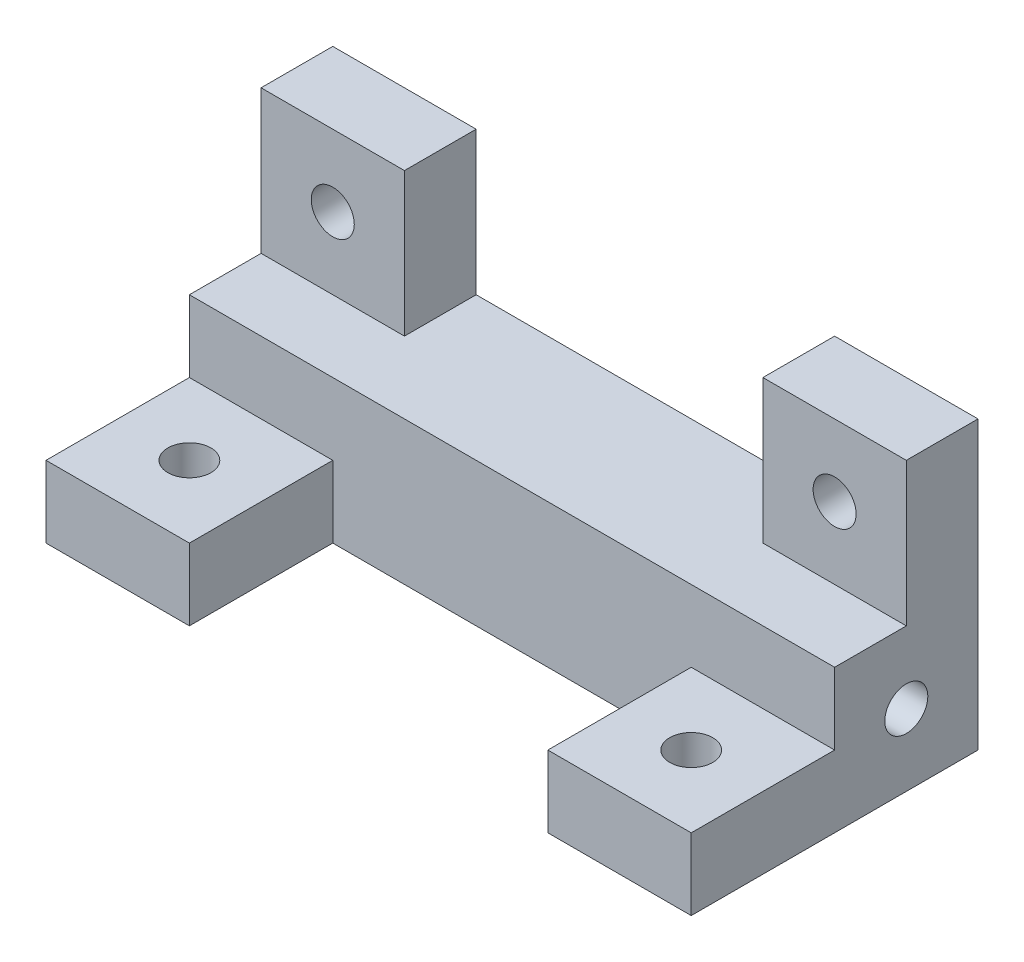
ISO-10303-21;
HEADER;
FILE_DESCRIPTION(('STEP AP214'),'2;1');
FILE_NAME('part.step','',(''),(''),'','','');
FILE_SCHEMA(('AUTOMOTIVE_DESIGN { 1 0 10303 214 1 1 1 1 }'));
ENDSEC;
DATA;
#1=APPLICATION_CONTEXT('core data for automotive mechanical design processes');
#2=APPLICATION_PROTOCOL_DEFINITION('international standard','automotive_design',2000,#1);
#3=PRODUCT_CONTEXT('',#1,'mechanical');
#4=PRODUCT('Part','Part','',(#3));
#5=PRODUCT_RELATED_PRODUCT_CATEGORY('part','',(#4));
#6=PRODUCT_DEFINITION_FORMATION('','',#4);
#7=PRODUCT_DEFINITION_CONTEXT('part definition',#1,'design');
#8=PRODUCT_DEFINITION('design','',#6,#7);
#9=PRODUCT_DEFINITION_SHAPE('','',#8);
#10=(LENGTH_UNIT() NAMED_UNIT(*) SI_UNIT(.MILLI.,.METRE.));
#11=(NAMED_UNIT(*) PLANE_ANGLE_UNIT() SI_UNIT($,.RADIAN.));
#12=(NAMED_UNIT(*) SI_UNIT($,.STERADIAN.) SOLID_ANGLE_UNIT());
#13=UNCERTAINTY_MEASURE_WITH_UNIT(LENGTH_MEASURE(1.E-05),#10,'distance_accuracy_value','');
#14=(GEOMETRIC_REPRESENTATION_CONTEXT(3) GLOBAL_UNCERTAINTY_ASSIGNED_CONTEXT((#13)) GLOBAL_UNIT_ASSIGNED_CONTEXT((#10,
#11,#12)) REPRESENTATION_CONTEXT('',''));
#15=CARTESIAN_POINT('',(0.,0.,0.));
#16=DIRECTION('',(0.,0.,1.));
#17=DIRECTION('',(1.,0.,0.));
#18=AXIS2_PLACEMENT_3D('',#15,#16,#17);
#19=CARTESIAN_POINT('',(0.,0.,10.));
#20=DIRECTION('',(0.,0.,-1.));
#21=DIRECTION('',(-1.,0.,0.));
#22=AXIS2_PLACEMENT_3D('',#19,#20,#21);
#23=PLANE('',#22);
#24=DIRECTION('',(-1.,0.,0.));
#25=VECTOR('',#24,1.);
#26=CARTESIAN_POINT('',(45.,5.,10.));
#27=LINE('',#26,#25);
#28=CARTESIAN_POINT('',(45.,5.,10.));
#29=VERTEX_POINT('',#28);
#30=CARTESIAN_POINT('',(35.,5.,10.));
#31=VERTEX_POINT('',#30);
#32=EDGE_CURVE('E341',#29,#31,#27,.T.);
#33=ORIENTED_EDGE('',*,*,#32,.F.);
#34=DIRECTION('',(0.,1.,0.));
#35=VECTOR('',#34,1.);
#36=CARTESIAN_POINT('',(45.,0.,10.));
#37=LINE('',#36,#35);
#38=CARTESIAN_POINT('',(45.,10.,10.));
#39=VERTEX_POINT('',#38);
#40=EDGE_CURVE('E167',#29,#39,#37,.T.);
#41=ORIENTED_EDGE('',*,*,#40,.T.);
#42=DIRECTION('',(-1.,0.,0.));
#43=VECTOR('',#42,1.);
#44=CARTESIAN_POINT('',(0.,10.,10.));
#45=LINE('',#44,#43);
#46=CARTESIAN_POINT('',(0.,10.,10.));
#47=VERTEX_POINT('',#46);
#48=EDGE_CURVE('E252',#39,#47,#45,.T.);
#49=ORIENTED_EDGE('',*,*,#48,.T.);
#50=DIRECTION('',(0.,-1.,0.));
#51=VECTOR('',#50,1.);
#52=CARTESIAN_POINT('',(0.,0.,10.));
#53=LINE('',#52,#51);
#54=CARTESIAN_POINT('',(0.,5.,10.));
#55=VERTEX_POINT('',#54);
#56=EDGE_CURVE('E247',#47,#55,#53,.T.);
#57=ORIENTED_EDGE('',*,*,#56,.T.);
#58=DIRECTION('',(-1.,0.,0.));
#59=VECTOR('',#58,1.);
#60=CARTESIAN_POINT('',(0.,5.,10.));
#61=LINE('',#60,#59);
#62=CARTESIAN_POINT('',(10.,5.,10.));
#63=VERTEX_POINT('',#62);
#64=EDGE_CURVE('E171',#63,#55,#61,.T.);
#65=ORIENTED_EDGE('',*,*,#64,.F.);
#66=DIRECTION('',(0.,1.,0.));
#67=VECTOR('',#66,1.);
#68=CARTESIAN_POINT('',(10.,0.,10.));
#69=LINE('',#68,#67);
#70=CARTESIAN_POINT('',(9.99999999999999,0.,10.));
#71=VERTEX_POINT('',#70);
#72=EDGE_CURVE('E168',#71,#63,#69,.T.);
#73=ORIENTED_EDGE('',*,*,#72,.F.);
#74=DIRECTION('',(1.,0.,0.));
#75=VECTOR('',#74,1.);
#76=CARTESIAN_POINT('',(0.,0.,10.));
#77=LINE('',#76,#75);
#78=CARTESIAN_POINT('',(35.,0.,10.));
#79=VERTEX_POINT('',#78);
#80=EDGE_CURVE('E53',#71,#79,#77,.T.);
#81=ORIENTED_EDGE('',*,*,#80,.T.);
#82=DIRECTION('',(0.,-1.,0.));
#83=VECTOR('',#82,1.);
#84=CARTESIAN_POINT('',(35.,0.,10.));
#85=LINE('',#84,#83);
#86=EDGE_CURVE('E48',#31,#79,#85,.T.);
#87=ORIENTED_EDGE('',*,*,#86,.F.);
#88=EDGE_LOOP('',(#33,#41,#49,#57,#65,#73,#81,#87));
#89=FACE_BOUND('',#88,.T.);
#90=ADVANCED_FACE('F33',(#89),#23,.F.);
#91=CARTESIAN_POINT('',(0.,10.,10.));
#92=DIRECTION('',(0.,-1.,0.));
#93=DIRECTION('',(0.,0.,-1.));
#94=AXIS2_PLACEMENT_3D('',#91,#92,#93);
#95=PLANE('',#94);
#96=DIRECTION('',(0.,0.,1.));
#97=VECTOR('',#96,1.);
#98=CARTESIAN_POINT('',(35.,10.,0.));
#99=LINE('',#98,#97);
#100=CARTESIAN_POINT('',(35.,10.,0.));
#101=VERTEX_POINT('',#100);
#102=CARTESIAN_POINT('',(35.,10.,5.));
#103=VERTEX_POINT('',#102);
#104=EDGE_CURVE('E197',#101,#103,#99,.T.);
#105=ORIENTED_EDGE('',*,*,#104,.F.);
#106=DIRECTION('',(-1.,0.,0.));
#107=VECTOR('',#106,1.);
#108=CARTESIAN_POINT('',(0.,10.,0.));
#109=LINE('',#108,#107);
#110=CARTESIAN_POINT('',(10.,10.,0.));
#111=VERTEX_POINT('',#110);
#112=EDGE_CURVE('E249',#101,#111,#109,.T.);
#113=ORIENTED_EDGE('',*,*,#112,.T.);
#114=DIRECTION('',(0.,0.,-1.));
#115=VECTOR('',#114,1.);
#116=CARTESIAN_POINT('',(10.,10.,0.));
#117=LINE('',#116,#115);
#118=CARTESIAN_POINT('',(10.,10.,5.));
#119=VERTEX_POINT('',#118);
#120=EDGE_CURVE('E226',#119,#111,#117,.T.);
#121=ORIENTED_EDGE('',*,*,#120,.F.);
#122=DIRECTION('',(1.,0.,0.));
#123=VECTOR('',#122,1.);
#124=CARTESIAN_POINT('',(0.,10.,5.));
#125=LINE('',#124,#123);
#126=CARTESIAN_POINT('',(0.,10.,5.));
#127=VERTEX_POINT('',#126);
#128=EDGE_CURVE('E221',#127,#119,#125,.T.);
#129=ORIENTED_EDGE('',*,*,#128,.F.);
#130=DIRECTION('',(0.,0.,-1.));
#131=VECTOR('',#130,1.);
#132=CARTESIAN_POINT('',(0.,10.,10.));
#133=LINE('',#132,#131);
#134=EDGE_CURVE('E254',#47,#127,#133,.T.);
#135=ORIENTED_EDGE('',*,*,#134,.F.);
#136=ORIENTED_EDGE('',*,*,#48,.F.);
#137=DIRECTION('',(0.,0.,-1.));
#138=VECTOR('',#137,1.);
#139=CARTESIAN_POINT('',(45.,10.,10.));
#140=LINE('',#139,#138);
#141=CARTESIAN_POINT('',(45.,10.,5.));
#142=VERTEX_POINT('',#141);
#143=EDGE_CURVE('E264',#39,#142,#140,.T.);
#144=ORIENTED_EDGE('',*,*,#143,.T.);
#145=DIRECTION('',(1.,0.,0.));
#146=VECTOR('',#145,1.);
#147=CARTESIAN_POINT('',(45.,10.,5.));
#148=LINE('',#147,#146);
#149=EDGE_CURVE('E202',#103,#142,#148,.T.);
#150=ORIENTED_EDGE('',*,*,#149,.F.);
#151=EDGE_LOOP('',(#105,#113,#121,#129,#135,#136,#144,#150));
#152=FACE_BOUND('',#151,.T.);
#153=ADVANCED_FACE('F283',(#152),#95,.F.);
#154=CARTESIAN_POINT('',(0.,0.,10.));
#155=DIRECTION('',(1.,0.,0.));
#156=DIRECTION('',(0.,0.,-1.));
#157=AXIS2_PLACEMENT_3D('',#154,#155,#156);
#158=PLANE('',#157);
#159=CARTESIAN_POINT('',(0.,5.,5.));
#160=DIRECTION('',(-1.,0.,0.));
#161=DIRECTION('',(0.,0.,1.));
#162=AXIS2_PLACEMENT_3D('',#159,#160,#161);
#163=CIRCLE('',#162,1.5);
#164=CARTESIAN_POINT('',(0.,5.,6.5));
#165=VERTEX_POINT('',#164);
#166=EDGE_CURVE('E346',#165,#165,#163,.T.);
#167=ORIENTED_EDGE('',*,*,#166,.F.);
#168=EDGE_LOOP('',(#167));
#169=FACE_BOUND('',#168,.T.);
#170=DIRECTION('',(0.,-1.,0.));
#171=VECTOR('',#170,1.);
#172=CARTESIAN_POINT('',(0.,0.,0.));
#173=LINE('',#172,#171);
#174=CARTESIAN_POINT('',(0.,20.,0.));
#175=VERTEX_POINT('',#174);
#176=CARTESIAN_POINT('',(0.,0.,0.));
#177=VERTEX_POINT('',#176);
#178=EDGE_CURVE('E246',#175,#177,#173,.T.);
#179=ORIENTED_EDGE('',*,*,#178,.T.);
#180=DIRECTION('',(0.,0.,-1.));
#181=VECTOR('',#180,1.);
#182=CARTESIAN_POINT('',(0.,0.,10.));
#183=LINE('',#182,#181);
#184=CARTESIAN_POINT('',(0.,0.,20.));
#185=VERTEX_POINT('',#184);
#186=EDGE_CURVE('E11',#185,#177,#183,.T.);
#187=ORIENTED_EDGE('',*,*,#186,.F.);
#188=DIRECTION('',(0.,-1.,0.));
#189=VECTOR('',#188,1.);
#190=CARTESIAN_POINT('',(0.,0.,20.));
#191=LINE('',#190,#189);
#192=CARTESIAN_POINT('',(0.,5.,20.));
#193=VERTEX_POINT('',#192);
#194=EDGE_CURVE('E177',#193,#185,#191,.T.);
#195=ORIENTED_EDGE('',*,*,#194,.F.);
#196=DIRECTION('',(0.,0.,-1.));
#197=VECTOR('',#196,1.);
#198=CARTESIAN_POINT('',(0.,5.,20.));
#199=LINE('',#198,#197);
#200=EDGE_CURVE('E185',#193,#55,#199,.T.);
#201=ORIENTED_EDGE('',*,*,#200,.T.);
#202=ORIENTED_EDGE('',*,*,#56,.F.);
#203=ORIENTED_EDGE('',*,*,#134,.T.);
#204=DIRECTION('',(0.,-1.,0.));
#205=VECTOR('',#204,1.);
#206=CARTESIAN_POINT('',(0.,20.,5.));
#207=LINE('',#206,#205);
#208=CARTESIAN_POINT('',(0.,20.,5.));
#209=VERTEX_POINT('',#208);
#210=EDGE_CURVE('E243',#209,#127,#207,.T.);
#211=ORIENTED_EDGE('',*,*,#210,.F.);
#212=DIRECTION('',(0.,0.,1.));
#213=VECTOR('',#212,1.);
#214=CARTESIAN_POINT('',(0.,20.,0.));
#215=LINE('',#214,#213);
#216=EDGE_CURVE('E222',#175,#209,#215,.T.);
#217=ORIENTED_EDGE('',*,*,#216,.F.);
#218=EDGE_LOOP('',(#179,#187,#195,#201,#202,#203,#211,#217));
#219=FACE_BOUND('',#218,.T.);
#220=ADVANCED_FACE('F35',(#169,#219),#158,.F.);
#221=CARTESIAN_POINT('',(0.,0.,10.));
#222=DIRECTION('',(0.,1.,0.));
#223=DIRECTION('',(0.,0.,1.));
#224=AXIS2_PLACEMENT_3D('',#221,#222,#223);
#225=PLANE('',#224);
#226=CARTESIAN_POINT('',(40.,0.,15.));
#227=DIRECTION('',(0.,1.,0.));
#228=DIRECTION('',(-1.,0.,0.));
#229=AXIS2_PLACEMENT_3D('',#226,#227,#228);
#230=CIRCLE('',#229,1.5);
#231=CARTESIAN_POINT('',(38.5,0.,15.));
#232=VERTEX_POINT('',#231);
#233=EDGE_CURVE('E323',#232,#232,#230,.T.);
#234=ORIENTED_EDGE('',*,*,#233,.T.);
#235=EDGE_LOOP('',(#234));
#236=FACE_BOUND('',#235,.T.);
#237=CARTESIAN_POINT('',(5.,0.,15.));
#238=DIRECTION('',(0.,1.,0.));
#239=DIRECTION('',(0.,0.,1.));
#240=AXIS2_PLACEMENT_3D('',#237,#238,#239);
#241=CIRCLE('',#240,1.5);
#242=CARTESIAN_POINT('',(5.,0.,16.5));
#243=VERTEX_POINT('',#242);
#244=EDGE_CURVE('E326',#243,#243,#241,.T.);
#245=ORIENTED_EDGE('',*,*,#244,.T.);
#246=EDGE_LOOP('',(#245));
#247=FACE_BOUND('',#246,.T.);
#248=DIRECTION('',(1.,0.,0.));
#249=VECTOR('',#248,1.);
#250=CARTESIAN_POINT('',(0.,0.,0.));
#251=LINE('',#250,#249);
#252=CARTESIAN_POINT('',(45.,0.,0.));
#253=VERTEX_POINT('',#252);
#254=EDGE_CURVE('E257',#177,#253,#251,.T.);
#255=ORIENTED_EDGE('',*,*,#254,.T.);
#256=DIRECTION('',(0.,0.,-1.));
#257=VECTOR('',#256,1.);
#258=CARTESIAN_POINT('',(45.,0.,10.));
#259=LINE('',#258,#257);
#260=CARTESIAN_POINT('',(45.,0.,20.));
#261=VERTEX_POINT('',#260);
#262=EDGE_CURVE('E41',#261,#253,#259,.T.);
#263=ORIENTED_EDGE('',*,*,#262,.F.);
#264=DIRECTION('',(1.,0.,0.));
#265=VECTOR('',#264,1.);
#266=CARTESIAN_POINT('',(45.,0.,20.));
#267=LINE('',#266,#265);
#268=CARTESIAN_POINT('',(35.,0.,20.));
#269=VERTEX_POINT('',#268);
#270=EDGE_CURVE('E161',#269,#261,#267,.T.);
#271=ORIENTED_EDGE('',*,*,#270,.F.);
#272=DIRECTION('',(0.,0.,-1.));
#273=VECTOR('',#272,1.);
#274=CARTESIAN_POINT('',(35.,0.,20.));
#275=LINE('',#274,#273);
#276=EDGE_CURVE('E173',#269,#79,#275,.T.);
#277=ORIENTED_EDGE('',*,*,#276,.T.);
#278=ORIENTED_EDGE('',*,*,#80,.F.);
#279=DIRECTION('',(0.,0.,-1.));
#280=VECTOR('',#279,1.);
#281=CARTESIAN_POINT('',(10.,0.,20.));
#282=LINE('',#281,#280);
#283=CARTESIAN_POINT('',(10.,0.,20.));
#284=VERTEX_POINT('',#283);
#285=EDGE_CURVE('E194',#284,#71,#282,.T.);
#286=ORIENTED_EDGE('',*,*,#285,.F.);
#287=DIRECTION('',(1.,0.,0.));
#288=VECTOR('',#287,1.);
#289=CARTESIAN_POINT('',(0.,0.,20.));
#290=LINE('',#289,#288);
#291=EDGE_CURVE('E180',#185,#284,#290,.T.);
#292=ORIENTED_EDGE('',*,*,#291,.F.);
#293=ORIENTED_EDGE('',*,*,#186,.T.);
#294=EDGE_LOOP('',(#255,#263,#271,#277,#278,#286,#292,#293));
#295=FACE_BOUND('',#294,.T.);
#296=ADVANCED_FACE('F312',(#236,#247,#295),#225,.F.);
#297=CARTESIAN_POINT('',(45.,0.,10.));
#298=DIRECTION('',(-1.,0.,0.));
#299=DIRECTION('',(0.,0.,1.));
#300=AXIS2_PLACEMENT_3D('',#297,#298,#299);
#301=PLANE('',#300);
#302=CARTESIAN_POINT('',(45.,5.,5.));
#303=DIRECTION('',(1.,0.,0.));
#304=DIRECTION('',(0.,0.,-1.));
#305=AXIS2_PLACEMENT_3D('',#302,#303,#304);
#306=CIRCLE('',#305,1.5);
#307=CARTESIAN_POINT('',(45.,5.,3.5));
#308=VERTEX_POINT('',#307);
#309=EDGE_CURVE('E366',#308,#308,#306,.T.);
#310=ORIENTED_EDGE('',*,*,#309,.F.);
#311=EDGE_LOOP('',(#310));
#312=FACE_BOUND('',#311,.T.);
#313=DIRECTION('',(0.,1.,0.));
#314=VECTOR('',#313,1.);
#315=CARTESIAN_POINT('',(45.,0.,0.));
#316=LINE('',#315,#314);
#317=CARTESIAN_POINT('',(45.,20.,0.));
#318=VERTEX_POINT('',#317);
#319=EDGE_CURVE('E259',#253,#318,#316,.T.);
#320=ORIENTED_EDGE('',*,*,#319,.T.);
#321=DIRECTION('',(0.,0.,-1.));
#322=VECTOR('',#321,1.);
#323=CARTESIAN_POINT('',(45.,20.,0.));
#324=LINE('',#323,#322);
#325=CARTESIAN_POINT('',(45.,20.,5.));
#326=VERTEX_POINT('',#325);
#327=EDGE_CURVE('E198',#326,#318,#324,.T.);
#328=ORIENTED_EDGE('',*,*,#327,.F.);
#329=DIRECTION('',(0.,-1.,0.));
#330=VECTOR('',#329,1.);
#331=CARTESIAN_POINT('',(45.,20.,5.));
#332=LINE('',#331,#330);
#333=EDGE_CURVE('E208',#326,#142,#332,.T.);
#334=ORIENTED_EDGE('',*,*,#333,.T.);
#335=ORIENTED_EDGE('',*,*,#143,.F.);
#336=ORIENTED_EDGE('',*,*,#40,.F.);
#337=DIRECTION('',(0.,0.,-1.));
#338=VECTOR('',#337,1.);
#339=CARTESIAN_POINT('',(45.,5.,20.));
#340=LINE('',#339,#338);
#341=CARTESIAN_POINT('',(45.,5.,20.));
#342=VERTEX_POINT('',#341);
#343=EDGE_CURVE('E149',#342,#29,#340,.T.);
#344=ORIENTED_EDGE('',*,*,#343,.F.);
#345=DIRECTION('',(0.,1.,0.));
#346=VECTOR('',#345,1.);
#347=CARTESIAN_POINT('',(45.,0.,20.));
#348=LINE('',#347,#346);
#349=EDGE_CURVE('E155',#261,#342,#348,.T.);
#350=ORIENTED_EDGE('',*,*,#349,.F.);
#351=ORIENTED_EDGE('',*,*,#262,.T.);
#352=EDGE_LOOP('',(#320,#328,#334,#335,#336,#344,#350,#351));
#353=FACE_BOUND('',#352,.T.);
#354=ADVANCED_FACE('F165',(#312,#353),#301,.F.);
#355=CARTESIAN_POINT('',(0.,0.,0.));
#356=DIRECTION('',(0.,0.,-1.));
#357=DIRECTION('',(-1.,0.,0.));
#358=AXIS2_PLACEMENT_3D('',#355,#356,#357);
#359=PLANE('',#358);
#360=CARTESIAN_POINT('',(40.,15.,0.));
#361=DIRECTION('',(0.,0.,1.));
#362=DIRECTION('',(1.,0.,0.));
#363=AXIS2_PLACEMENT_3D('',#360,#361,#362);
#364=CIRCLE('',#363,1.5);
#365=CARTESIAN_POINT('',(41.5,15.,0.));
#366=VERTEX_POINT('',#365);
#367=EDGE_CURVE('E369',#366,#366,#364,.T.);
#368=ORIENTED_EDGE('',*,*,#367,.T.);
#369=EDGE_LOOP('',(#368));
#370=FACE_BOUND('',#369,.T.);
#371=CARTESIAN_POINT('',(5.,15.,0.));
#372=DIRECTION('',(0.,0.,1.));
#373=DIRECTION('',(1.,0.,0.));
#374=AXIS2_PLACEMENT_3D('',#371,#372,#373);
#375=CIRCLE('',#374,1.5);
#376=CARTESIAN_POINT('',(6.5,15.,0.));
#377=VERTEX_POINT('',#376);
#378=EDGE_CURVE('E354',#377,#377,#375,.T.);
#379=ORIENTED_EDGE('',*,*,#378,.T.);
#380=EDGE_LOOP('',(#379));
#381=FACE_BOUND('',#380,.T.);
#382=ORIENTED_EDGE('',*,*,#178,.F.);
#383=DIRECTION('',(-1.,0.,0.));
#384=VECTOR('',#383,1.);
#385=CARTESIAN_POINT('',(0.,20.,0.));
#386=LINE('',#385,#384);
#387=CARTESIAN_POINT('',(10.,20.,0.));
#388=VERTEX_POINT('',#387);
#389=EDGE_CURVE('E230',#388,#175,#386,.T.);
#390=ORIENTED_EDGE('',*,*,#389,.F.);
#391=DIRECTION('',(0.,-1.,0.));
#392=VECTOR('',#391,1.);
#393=CARTESIAN_POINT('',(10.,20.,0.));
#394=LINE('',#393,#392);
#395=EDGE_CURVE('E233',#388,#111,#394,.T.);
#396=ORIENTED_EDGE('',*,*,#395,.T.);
#397=ORIENTED_EDGE('',*,*,#112,.F.);
#398=DIRECTION('',(0.,-1.,0.));
#399=VECTOR('',#398,1.);
#400=CARTESIAN_POINT('',(35.,20.,0.));
#401=LINE('',#400,#399);
#402=CARTESIAN_POINT('',(35.,20.,0.));
#403=VERTEX_POINT('',#402);
#404=EDGE_CURVE('E218',#403,#101,#401,.T.);
#405=ORIENTED_EDGE('',*,*,#404,.F.);
#406=DIRECTION('',(-1.,0.,0.));
#407=VECTOR('',#406,1.);
#408=CARTESIAN_POINT('',(45.,20.,0.));
#409=LINE('',#408,#407);
#410=EDGE_CURVE('E201',#318,#403,#409,.T.);
#411=ORIENTED_EDGE('',*,*,#410,.F.);
#412=ORIENTED_EDGE('',*,*,#319,.F.);
#413=ORIENTED_EDGE('',*,*,#254,.F.);
#414=EDGE_LOOP('',(#382,#390,#396,#397,#405,#411,#412,#413));
#415=FACE_BOUND('',#414,.T.);
#416=ADVANCED_FACE('F270',(#370,#381,#415),#359,.T.);
#417=CARTESIAN_POINT('',(0.,20.,5.));
#418=DIRECTION('',(0.,0.,-1.));
#419=DIRECTION('',(-1.,0.,0.));
#420=AXIS2_PLACEMENT_3D('',#417,#418,#419);
#421=PLANE('',#420);
#422=CARTESIAN_POINT('',(5.,15.,5.));
#423=DIRECTION('',(0.,0.,1.));
#424=DIRECTION('',(1.,0.,0.));
#425=AXIS2_PLACEMENT_3D('',#422,#423,#424);
#426=CIRCLE('',#425,1.5);
#427=CARTESIAN_POINT('',(6.5,15.,5.));
#428=VERTEX_POINT('',#427);
#429=EDGE_CURVE('E356',#428,#428,#426,.T.);
#430=ORIENTED_EDGE('',*,*,#429,.F.);
#431=EDGE_LOOP('',(#430));
#432=FACE_BOUND('',#431,.T.);
#433=ORIENTED_EDGE('',*,*,#128,.T.);
#434=DIRECTION('',(0.,-1.,0.));
#435=VECTOR('',#434,1.);
#436=CARTESIAN_POINT('',(10.,20.,5.));
#437=LINE('',#436,#435);
#438=CARTESIAN_POINT('',(10.,20.,5.));
#439=VERTEX_POINT('',#438);
#440=EDGE_CURVE('E240',#439,#119,#437,.T.);
#441=ORIENTED_EDGE('',*,*,#440,.F.);
#442=DIRECTION('',(1.,0.,0.));
#443=VECTOR('',#442,1.);
#444=CARTESIAN_POINT('',(0.,20.,5.));
#445=LINE('',#444,#443);
#446=EDGE_CURVE('E225',#209,#439,#445,.T.);
#447=ORIENTED_EDGE('',*,*,#446,.F.);
#448=ORIENTED_EDGE('',*,*,#210,.T.);
#449=EDGE_LOOP('',(#433,#441,#447,#448));
#450=FACE_BOUND('',#449,.T.);
#451=ADVANCED_FACE('F306',(#432,#450),#421,.F.);
#452=CARTESIAN_POINT('',(10.,20.,0.));
#453=DIRECTION('',(-1.,0.,0.));
#454=DIRECTION('',(0.,0.,1.));
#455=AXIS2_PLACEMENT_3D('',#452,#453,#454);
#456=PLANE('',#455);
#457=ORIENTED_EDGE('',*,*,#120,.T.);
#458=ORIENTED_EDGE('',*,*,#395,.F.);
#459=DIRECTION('',(0.,0.,-1.));
#460=VECTOR('',#459,1.);
#461=CARTESIAN_POINT('',(10.,20.,0.));
#462=LINE('',#461,#460);
#463=EDGE_CURVE('E228',#439,#388,#462,.T.);
#464=ORIENTED_EDGE('',*,*,#463,.F.);
#465=ORIENTED_EDGE('',*,*,#440,.T.);
#466=EDGE_LOOP('',(#457,#458,#464,#465));
#467=FACE_BOUND('',#466,.T.);
#468=ADVANCED_FACE('F295',(#467),#456,.F.);
#469=CARTESIAN_POINT('',(0.,20.,0.));
#470=DIRECTION('',(0.,1.,0.));
#471=DIRECTION('',(0.,0.,1.));
#472=AXIS2_PLACEMENT_3D('',#469,#470,#471);
#473=PLANE('',#472);
#474=ORIENTED_EDGE('',*,*,#216,.T.);
#475=ORIENTED_EDGE('',*,*,#446,.T.);
#476=ORIENTED_EDGE('',*,*,#463,.T.);
#477=ORIENTED_EDGE('',*,*,#389,.T.);
#478=EDGE_LOOP('',(#474,#475,#476,#477));
#479=FACE_BOUND('',#478,.T.);
#480=ADVANCED_FACE('F287',(#479),#473,.T.);
#481=CARTESIAN_POINT('',(35.,20.,0.));
#482=DIRECTION('',(1.,0.,0.));
#483=DIRECTION('',(0.,0.,-1.));
#484=AXIS2_PLACEMENT_3D('',#481,#482,#483);
#485=PLANE('',#484);
#486=ORIENTED_EDGE('',*,*,#104,.T.);
#487=DIRECTION('',(0.,-1.,0.));
#488=VECTOR('',#487,1.);
#489=CARTESIAN_POINT('',(35.,20.,5.));
#490=LINE('',#489,#488);
#491=CARTESIAN_POINT('',(35.,20.,5.));
#492=VERTEX_POINT('',#491);
#493=EDGE_CURVE('E215',#492,#103,#490,.T.);
#494=ORIENTED_EDGE('',*,*,#493,.F.);
#495=DIRECTION('',(0.,0.,1.));
#496=VECTOR('',#495,1.);
#497=CARTESIAN_POINT('',(35.,20.,0.));
#498=LINE('',#497,#496);
#499=EDGE_CURVE('E204',#403,#492,#498,.T.);
#500=ORIENTED_EDGE('',*,*,#499,.F.);
#501=ORIENTED_EDGE('',*,*,#404,.T.);
#502=EDGE_LOOP('',(#486,#494,#500,#501));
#503=FACE_BOUND('',#502,.T.);
#504=ADVANCED_FACE('F285',(#503),#485,.F.);
#505=CARTESIAN_POINT('',(45.,20.,5.));
#506=DIRECTION('',(0.,0.,-1.));
#507=DIRECTION('',(-1.,0.,0.));
#508=AXIS2_PLACEMENT_3D('',#505,#506,#507);
#509=PLANE('',#508);
#510=CARTESIAN_POINT('',(40.,15.,5.));
#511=DIRECTION('',(0.,0.,1.));
#512=DIRECTION('',(1.,0.,0.));
#513=AXIS2_PLACEMENT_3D('',#510,#511,#512);
#514=CIRCLE('',#513,1.5);
#515=CARTESIAN_POINT('',(41.5,15.,5.));
#516=VERTEX_POINT('',#515);
#517=EDGE_CURVE('E372',#516,#516,#514,.T.);
#518=ORIENTED_EDGE('',*,*,#517,.F.);
#519=EDGE_LOOP('',(#518));
#520=FACE_BOUND('',#519,.T.);
#521=ORIENTED_EDGE('',*,*,#149,.T.);
#522=ORIENTED_EDGE('',*,*,#333,.F.);
#523=DIRECTION('',(1.,0.,0.));
#524=VECTOR('',#523,1.);
#525=CARTESIAN_POINT('',(45.,20.,5.));
#526=LINE('',#525,#524);
#527=EDGE_CURVE('E206',#492,#326,#526,.T.);
#528=ORIENTED_EDGE('',*,*,#527,.F.);
#529=ORIENTED_EDGE('',*,*,#493,.T.);
#530=EDGE_LOOP('',(#521,#522,#528,#529));
#531=FACE_BOUND('',#530,.T.);
#532=ADVANCED_FACE('F279',(#520,#531),#509,.F.);
#533=CARTESIAN_POINT('',(0.,20.,0.));
#534=DIRECTION('',(0.,-1.,0.));
#535=DIRECTION('',(0.,0.,-1.));
#536=AXIS2_PLACEMENT_3D('',#533,#534,#535);
#537=PLANE('',#536);
#538=ORIENTED_EDGE('',*,*,#327,.T.);
#539=ORIENTED_EDGE('',*,*,#410,.T.);
#540=ORIENTED_EDGE('',*,*,#499,.T.);
#541=ORIENTED_EDGE('',*,*,#527,.T.);
#542=EDGE_LOOP('',(#538,#539,#540,#541));
#543=FACE_BOUND('',#542,.T.);
#544=ADVANCED_FACE('F274',(#543),#537,.F.);
#545=CARTESIAN_POINT('',(10.,0.,20.));
#546=DIRECTION('',(-1.,0.,0.));
#547=DIRECTION('',(0.,-1.,0.));
#548=AXIS2_PLACEMENT_3D('',#545,#546,#547);
#549=PLANE('',#548);
#550=ORIENTED_EDGE('',*,*,#72,.T.);
#551=DIRECTION('',(0.,0.,-1.));
#552=VECTOR('',#551,1.);
#553=CARTESIAN_POINT('',(10.,5.,20.));
#554=LINE('',#553,#552);
#555=CARTESIAN_POINT('',(10.,5.,20.));
#556=VERTEX_POINT('',#555);
#557=EDGE_CURVE('E191',#556,#63,#554,.T.);
#558=ORIENTED_EDGE('',*,*,#557,.F.);
#559=DIRECTION('',(0.,1.,0.));
#560=VECTOR('',#559,1.);
#561=CARTESIAN_POINT('',(10.,0.,20.));
#562=LINE('',#561,#560);
#563=EDGE_CURVE('E182',#284,#556,#562,.T.);
#564=ORIENTED_EDGE('',*,*,#563,.F.);
#565=ORIENTED_EDGE('',*,*,#285,.T.);
#566=EDGE_LOOP('',(#550,#558,#564,#565));
#567=FACE_BOUND('',#566,.T.);
#568=ADVANCED_FACE('F401',(#567),#549,.F.);
#569=CARTESIAN_POINT('',(0.,5.,20.));
#570=DIRECTION('',(0.,-1.,0.));
#571=DIRECTION('',(0.,0.,-1.));
#572=AXIS2_PLACEMENT_3D('',#569,#570,#571);
#573=PLANE('',#572);
#574=CARTESIAN_POINT('',(5.,5.,15.));
#575=DIRECTION('',(0.,1.,0.));
#576=DIRECTION('',(0.,0.,1.));
#577=AXIS2_PLACEMENT_3D('',#574,#575,#576);
#578=CIRCLE('',#577,1.5);
#579=CARTESIAN_POINT('',(5.,5.,16.5));
#580=VERTEX_POINT('',#579);
#581=EDGE_CURVE('E361',#580,#580,#578,.T.);
#582=ORIENTED_EDGE('',*,*,#581,.F.);
#583=EDGE_LOOP('',(#582));
#584=FACE_BOUND('',#583,.T.);
#585=ORIENTED_EDGE('',*,*,#64,.T.);
#586=ORIENTED_EDGE('',*,*,#200,.F.);
#587=DIRECTION('',(-1.,0.,0.));
#588=VECTOR('',#587,1.);
#589=CARTESIAN_POINT('',(0.,5.,20.));
#590=LINE('',#589,#588);
#591=EDGE_CURVE('E184',#556,#193,#590,.T.);
#592=ORIENTED_EDGE('',*,*,#591,.F.);
#593=ORIENTED_EDGE('',*,*,#557,.T.);
#594=EDGE_LOOP('',(#585,#586,#592,#593));
#595=FACE_BOUND('',#594,.T.);
#596=ADVANCED_FACE('F394',(#584,#595),#573,.F.);
#597=CARTESIAN_POINT('',(0.,0.,20.));
#598=DIRECTION('',(0.,0.,-1.));
#599=DIRECTION('',(-1.,0.,0.));
#600=AXIS2_PLACEMENT_3D('',#597,#598,#599);
#601=PLANE('',#600);
#602=ORIENTED_EDGE('',*,*,#194,.T.);
#603=ORIENTED_EDGE('',*,*,#291,.T.);
#604=ORIENTED_EDGE('',*,*,#563,.T.);
#605=ORIENTED_EDGE('',*,*,#591,.T.);
#606=EDGE_LOOP('',(#602,#603,#604,#605));
#607=FACE_BOUND('',#606,.T.);
#608=ADVANCED_FACE('F386',(#607),#601,.F.);
#609=CARTESIAN_POINT('',(45.,5.,20.));
#610=DIRECTION('',(0.,-1.,0.));
#611=DIRECTION('',(1.,0.,0.));
#612=AXIS2_PLACEMENT_3D('',#609,#610,#611);
#613=PLANE('',#612);
#614=CARTESIAN_POINT('',(40.,5.,15.));
#615=DIRECTION('',(0.,1.,0.));
#616=DIRECTION('',(-1.,0.,0.));
#617=AXIS2_PLACEMENT_3D('',#614,#615,#616);
#618=CIRCLE('',#617,1.5);
#619=CARTESIAN_POINT('',(38.5,5.,15.));
#620=VERTEX_POINT('',#619);
#621=EDGE_CURVE('E377',#620,#620,#618,.T.);
#622=ORIENTED_EDGE('',*,*,#621,.F.);
#623=EDGE_LOOP('',(#622));
#624=FACE_BOUND('',#623,.T.);
#625=ORIENTED_EDGE('',*,*,#32,.T.);
#626=DIRECTION('',(0.,0.,-1.));
#627=VECTOR('',#626,1.);
#628=CARTESIAN_POINT('',(35.,5.,20.));
#629=LINE('',#628,#627);
#630=CARTESIAN_POINT('',(35.,5.,20.));
#631=VERTEX_POINT('',#630);
#632=EDGE_CURVE('E151',#631,#31,#629,.T.);
#633=ORIENTED_EDGE('',*,*,#632,.F.);
#634=DIRECTION('',(-1.,0.,0.));
#635=VECTOR('',#634,1.);
#636=CARTESIAN_POINT('',(45.,5.,20.));
#637=LINE('',#636,#635);
#638=EDGE_CURVE('E145',#342,#631,#637,.T.);
#639=ORIENTED_EDGE('',*,*,#638,.F.);
#640=ORIENTED_EDGE('',*,*,#343,.T.);
#641=EDGE_LOOP('',(#625,#633,#639,#640));
#642=FACE_BOUND('',#641,.T.);
#643=ADVANCED_FACE('F147',(#624,#642),#613,.F.);
#644=CARTESIAN_POINT('',(35.,0.,20.));
#645=DIRECTION('',(1.,0.,0.));
#646=DIRECTION('',(0.,0.,-1.));
#647=AXIS2_PLACEMENT_3D('',#644,#645,#646);
#648=PLANE('',#647);
#649=ORIENTED_EDGE('',*,*,#86,.T.);
#650=ORIENTED_EDGE('',*,*,#276,.F.);
#651=DIRECTION('',(0.,-1.,0.));
#652=VECTOR('',#651,1.);
#653=CARTESIAN_POINT('',(35.,0.,20.));
#654=LINE('',#653,#652);
#655=EDGE_CURVE('E154',#631,#269,#654,.T.);
#656=ORIENTED_EDGE('',*,*,#655,.F.);
#657=ORIENTED_EDGE('',*,*,#632,.T.);
#658=EDGE_LOOP('',(#649,#650,#656,#657));
#659=FACE_BOUND('',#658,.T.);
#660=ADVANCED_FACE('F385',(#659),#648,.F.);
#661=CARTESIAN_POINT('',(0.,0.,20.));
#662=DIRECTION('',(0.,0.,1.));
#663=DIRECTION('',(1.,0.,0.));
#664=AXIS2_PLACEMENT_3D('',#661,#662,#663);
#665=PLANE('',#664);
#666=ORIENTED_EDGE('',*,*,#349,.T.);
#667=ORIENTED_EDGE('',*,*,#638,.T.);
#668=ORIENTED_EDGE('',*,*,#655,.T.);
#669=ORIENTED_EDGE('',*,*,#270,.T.);
#670=EDGE_LOOP('',(#666,#667,#668,#669));
#671=FACE_BOUND('',#670,.T.);
#672=ADVANCED_FACE('F159',(#671),#665,.T.);
#673=CARTESIAN_POINT('',(5.,5.,5.));
#674=DIRECTION('',(-1.,0.,0.));
#675=DIRECTION('',(0.,0.,1.));
#676=AXIS2_PLACEMENT_3D('',#673,#674,#675);
#677=CYLINDRICAL_SURFACE('',#676,1.5);
#678=CARTESIAN_POINT('',(5.,5.,5.));
#679=DIRECTION('',(-1.,0.,0.));
#680=DIRECTION('',(0.,0.,1.));
#681=AXIS2_PLACEMENT_3D('',#678,#679,#680);
#682=CIRCLE('',#681,1.5);
#683=CARTESIAN_POINT('',(5.,5.,6.5));
#684=VERTEX_POINT('',#683);
#685=EDGE_CURVE('E342',#684,#684,#682,.T.);
#686=ORIENTED_EDGE('',*,*,#685,.F.);
#687=EDGE_LOOP('',(#686));
#688=FACE_BOUND('',#687,.T.);
#689=ORIENTED_EDGE('',*,*,#166,.T.);
#690=EDGE_LOOP('',(#689));
#691=FACE_BOUND('',#690,.T.);
#692=ADVANCED_FACE('F441',(#688,#691),#677,.F.);
#693=CARTESIAN_POINT('',(5.,5.,5.));
#694=DIRECTION('',(-1.,0.,0.));
#695=DIRECTION('',(0.,0.,1.));
#696=AXIS2_PLACEMENT_3D('',#693,#694,#695);
#697=PLANE('',#696);
#698=ORIENTED_EDGE('',*,*,#685,.T.);
#699=EDGE_LOOP('',(#698));
#700=FACE_BOUND('',#699,.T.);
#701=ADVANCED_FACE('F458',(#700),#697,.T.);
#702=CARTESIAN_POINT('',(5.,15.,0.));
#703=DIRECTION('',(0.,0.,1.));
#704=DIRECTION('',(1.,0.,0.));
#705=AXIS2_PLACEMENT_3D('',#702,#703,#704);
#706=CYLINDRICAL_SURFACE('',#705,1.5);
#707=ORIENTED_EDGE('',*,*,#378,.F.);
#708=EDGE_LOOP('',(#707));
#709=FACE_BOUND('',#708,.T.);
#710=ORIENTED_EDGE('',*,*,#429,.T.);
#711=EDGE_LOOP('',(#710));
#712=FACE_BOUND('',#711,.T.);
#713=ADVANCED_FACE('F468',(#709,#712),#706,.F.);
#714=CARTESIAN_POINT('',(5.,0.,15.));
#715=DIRECTION('',(0.,1.,0.));
#716=DIRECTION('',(0.,0.,1.));
#717=AXIS2_PLACEMENT_3D('',#714,#715,#716);
#718=CYLINDRICAL_SURFACE('',#717,1.5);
#719=ORIENTED_EDGE('',*,*,#244,.F.);
#720=EDGE_LOOP('',(#719));
#721=FACE_BOUND('',#720,.T.);
#722=ORIENTED_EDGE('',*,*,#581,.T.);
#723=EDGE_LOOP('',(#722));
#724=FACE_BOUND('',#723,.T.);
#725=ADVANCED_FACE('F487',(#721,#724),#718,.F.);
#726=CARTESIAN_POINT('',(40.,5.,5.));
#727=DIRECTION('',(1.,0.,0.));
#728=DIRECTION('',(0.,0.,-1.));
#729=AXIS2_PLACEMENT_3D('',#726,#727,#728);
#730=CYLINDRICAL_SURFACE('',#729,1.5);
#731=CARTESIAN_POINT('',(40.,5.,5.));
#732=DIRECTION('',(1.,0.,0.));
#733=DIRECTION('',(0.,0.,-1.));
#734=AXIS2_PLACEMENT_3D('',#731,#732,#733);
#735=CIRCLE('',#734,1.5);
#736=CARTESIAN_POINT('',(40.,5.,3.5));
#737=VERTEX_POINT('',#736);
#738=EDGE_CURVE('E364',#737,#737,#735,.T.);
#739=ORIENTED_EDGE('',*,*,#738,.F.);
#740=EDGE_LOOP('',(#739));
#741=FACE_BOUND('',#740,.T.);
#742=ORIENTED_EDGE('',*,*,#309,.T.);
#743=EDGE_LOOP('',(#742));
#744=FACE_BOUND('',#743,.T.);
#745=ADVANCED_FACE('F497',(#741,#744),#730,.F.);
#746=CARTESIAN_POINT('',(40.,5.,5.));
#747=DIRECTION('',(1.,0.,0.));
#748=DIRECTION('',(0.,0.,-1.));
#749=AXIS2_PLACEMENT_3D('',#746,#747,#748);
#750=PLANE('',#749);
#751=ORIENTED_EDGE('',*,*,#738,.T.);
#752=EDGE_LOOP('',(#751));
#753=FACE_BOUND('',#752,.T.);
#754=ADVANCED_FACE('F505',(#753),#750,.T.);
#755=CARTESIAN_POINT('',(40.,15.,0.));
#756=DIRECTION('',(0.,0.,1.));
#757=DIRECTION('',(1.,0.,0.));
#758=AXIS2_PLACEMENT_3D('',#755,#756,#757);
#759=CYLINDRICAL_SURFACE('',#758,1.5);
#760=ORIENTED_EDGE('',*,*,#367,.F.);
#761=EDGE_LOOP('',(#760));
#762=FACE_BOUND('',#761,.T.);
#763=ORIENTED_EDGE('',*,*,#517,.T.);
#764=EDGE_LOOP('',(#763));
#765=FACE_BOUND('',#764,.T.);
#766=ADVANCED_FACE('F513',(#762,#765),#759,.F.);
#767=CARTESIAN_POINT('',(40.,0.,15.));
#768=DIRECTION('',(0.,1.,0.));
#769=DIRECTION('',(-1.,0.,0.));
#770=AXIS2_PLACEMENT_3D('',#767,#768,#769);
#771=CYLINDRICAL_SURFACE('',#770,1.5);
#772=ORIENTED_EDGE('',*,*,#233,.F.);
#773=EDGE_LOOP('',(#772));
#774=FACE_BOUND('',#773,.T.);
#775=ORIENTED_EDGE('',*,*,#621,.T.);
#776=EDGE_LOOP('',(#775));
#777=FACE_BOUND('',#776,.T.);
#778=ADVANCED_FACE('F382',(#774,#777),#771,.F.);
#779=CLOSED_SHELL('',(#90,#153,#220,#296,#354,#416,#451,#468,#480,#504,#532,#544,#568,#596,#608,
#643,#660,#672,#692,#701,#713,#725,#745,#754,#766,#778));
#780=MANIFOLD_SOLID_BREP('B2',#779);
#781=ADVANCED_BREP_SHAPE_REPRESENTATION('',(#18,#780),#14);
#782=SHAPE_DEFINITION_REPRESENTATION(#9,#781);
ENDSEC;
END-ISO-10303-21;
